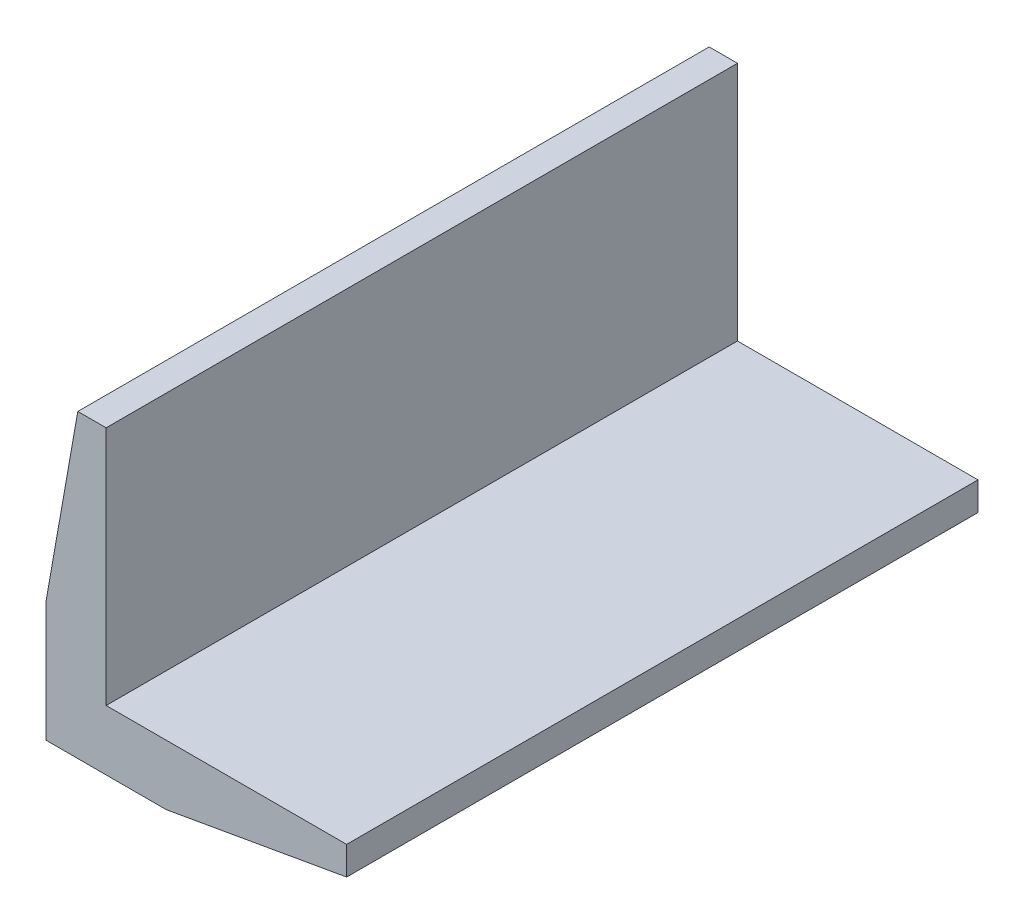
ISO-10303-21;
HEADER;
FILE_DESCRIPTION(('STEP AP214'),'2;1');
FILE_NAME('part.step','',(''),(''),'','','');
FILE_SCHEMA(('AUTOMOTIVE_DESIGN { 1 0 10303 214 1 1 1 1 }'));
ENDSEC;
DATA;
#1=APPLICATION_CONTEXT('core data for automotive mechanical design processes');
#2=APPLICATION_PROTOCOL_DEFINITION('international standard','automotive_design',2000,#1);
#3=PRODUCT_CONTEXT('',#1,'mechanical');
#4=PRODUCT('Part','Part','',(#3));
#5=PRODUCT_RELATED_PRODUCT_CATEGORY('part','',(#4));
#6=PRODUCT_DEFINITION_FORMATION('','',#4);
#7=PRODUCT_DEFINITION_CONTEXT('part definition',#1,'design');
#8=PRODUCT_DEFINITION('design','',#6,#7);
#9=PRODUCT_DEFINITION_SHAPE('','',#8);
#10=(LENGTH_UNIT() NAMED_UNIT(*) SI_UNIT(.MILLI.,.METRE.));
#11=(NAMED_UNIT(*) PLANE_ANGLE_UNIT() SI_UNIT($,.RADIAN.));
#12=(NAMED_UNIT(*) SI_UNIT($,.STERADIAN.) SOLID_ANGLE_UNIT());
#13=UNCERTAINTY_MEASURE_WITH_UNIT(LENGTH_MEASURE(1.E-05),#10,'distance_accuracy_value','');
#14=(GEOMETRIC_REPRESENTATION_CONTEXT(3) GLOBAL_UNCERTAINTY_ASSIGNED_CONTEXT((#13)) GLOBAL_UNIT_ASSIGNED_CONTEXT((#10,
#11,#12)) REPRESENTATION_CONTEXT('',''));
#15=CARTESIAN_POINT('',(0.,0.,0.));
#16=DIRECTION('',(0.,0.,1.));
#17=DIRECTION('',(1.,0.,0.));
#18=AXIS2_PLACEMENT_3D('',#15,#16,#17);
#19=CARTESIAN_POINT('',(20.,0.,42.));
#20=DIRECTION('',(0.,1.,0.));
#21=DIRECTION('',(-1.,0.,0.));
#22=AXIS2_PLACEMENT_3D('',#19,#20,#21);
#23=PLANE('',#22);
#24=CARTESIAN_POINT('',(4.,0.,40.));
#25=DIRECTION('',(0.,1.,0.));
#26=DIRECTION('',(1.,0.,0.));
#27=AXIS2_PLACEMENT_3D('',#24,#25,#26);
#28=ELLIPSE('',#27,1.59099025766973,1.125);
#29=CARTESIAN_POINT('',(5.59099025766973,0.,40.));
#30=VERTEX_POINT('',#29);
#31=EDGE_CURVE('E137',#30,#30,#28,.T.);
#32=ORIENTED_EDGE('',*,*,#31,.T.);
#33=EDGE_LOOP('',(#32));
#34=FACE_BOUND('',#33,.T.);
#35=CARTESIAN_POINT('',(4.,0.,37.2857142857143));
#36=DIRECTION('',(0.,1.,0.));
#37=DIRECTION('',(1.,0.,0.));
#38=AXIS2_PLACEMENT_3D('',#35,#36,#37);
#39=ELLIPSE('',#38,1.59099025766973,1.125);
#40=CARTESIAN_POINT('',(5.59099025766973,0.,37.2857142857143));
#41=VERTEX_POINT('',#40);
#42=EDGE_CURVE('E208',#41,#41,#39,.T.);
#43=ORIENTED_EDGE('',*,*,#42,.T.);
#44=EDGE_LOOP('',(#43));
#45=FACE_BOUND('',#44,.T.);
#46=CARTESIAN_POINT('',(4.,0.,34.5714285714286));
#47=DIRECTION('',(0.,1.,0.));
#48=DIRECTION('',(1.,0.,0.));
#49=AXIS2_PLACEMENT_3D('',#46,#47,#48);
#50=ELLIPSE('',#49,1.59099025766973,1.125);
#51=CARTESIAN_POINT('',(5.59099025766973,0.,34.5714285714286));
#52=VERTEX_POINT('',#51);
#53=EDGE_CURVE('E204',#52,#52,#50,.T.);
#54=ORIENTED_EDGE('',*,*,#53,.T.);
#55=EDGE_LOOP('',(#54));
#56=FACE_BOUND('',#55,.T.);
#57=CARTESIAN_POINT('',(4.,0.,31.8571428571429));
#58=DIRECTION('',(0.,1.,0.));
#59=DIRECTION('',(1.,0.,0.));
#60=AXIS2_PLACEMENT_3D('',#57,#58,#59);
#61=ELLIPSE('',#60,1.59099025766973,1.125);
#62=CARTESIAN_POINT('',(5.59099025766973,0.,31.8571428571429));
#63=VERTEX_POINT('',#62);
#64=EDGE_CURVE('E200',#63,#63,#61,.T.);
#65=ORIENTED_EDGE('',*,*,#64,.T.);
#66=EDGE_LOOP('',(#65));
#67=FACE_BOUND('',#66,.T.);
#68=CARTESIAN_POINT('',(4.,0.,29.1428571428571));
#69=DIRECTION('',(0.,1.,0.));
#70=DIRECTION('',(1.,0.,0.));
#71=AXIS2_PLACEMENT_3D('',#68,#69,#70);
#72=ELLIPSE('',#71,1.59099025766973,1.125);
#73=CARTESIAN_POINT('',(5.59099025766974,0.,29.1428571428571));
#74=VERTEX_POINT('',#73);
#75=EDGE_CURVE('E196',#74,#74,#72,.T.);
#76=ORIENTED_EDGE('',*,*,#75,.T.);
#77=EDGE_LOOP('',(#76));
#78=FACE_BOUND('',#77,.T.);
#79=CARTESIAN_POINT('',(4.,0.,26.4285714285714));
#80=DIRECTION('',(0.,1.,0.));
#81=DIRECTION('',(1.,0.,0.));
#82=AXIS2_PLACEMENT_3D('',#79,#80,#81);
#83=ELLIPSE('',#82,1.59099025766973,1.125);
#84=CARTESIAN_POINT('',(5.59099025766974,0.,26.4285714285714));
#85=VERTEX_POINT('',#84);
#86=EDGE_CURVE('E192',#85,#85,#83,.T.);
#87=ORIENTED_EDGE('',*,*,#86,.T.);
#88=EDGE_LOOP('',(#87));
#89=FACE_BOUND('',#88,.T.);
#90=CARTESIAN_POINT('',(4.,0.,23.7142857142857));
#91=DIRECTION('',(0.,1.,0.));
#92=DIRECTION('',(1.,0.,0.));
#93=AXIS2_PLACEMENT_3D('',#90,#91,#92);
#94=ELLIPSE('',#93,1.59099025766973,1.125);
#95=CARTESIAN_POINT('',(5.59099025766974,0.,23.7142857142857));
#96=VERTEX_POINT('',#95);
#97=EDGE_CURVE('E188',#96,#96,#94,.T.);
#98=ORIENTED_EDGE('',*,*,#97,.T.);
#99=EDGE_LOOP('',(#98));
#100=FACE_BOUND('',#99,.T.);
#101=CARTESIAN_POINT('',(4.,0.,21.));
#102=DIRECTION('',(0.,1.,0.));
#103=DIRECTION('',(1.,0.,0.));
#104=AXIS2_PLACEMENT_3D('',#101,#102,#103);
#105=ELLIPSE('',#104,1.59099025766973,1.125);
#106=CARTESIAN_POINT('',(5.59099025766974,0.,21.));
#107=VERTEX_POINT('',#106);
#108=EDGE_CURVE('E184',#107,#107,#105,.T.);
#109=ORIENTED_EDGE('',*,*,#108,.T.);
#110=EDGE_LOOP('',(#109));
#111=FACE_BOUND('',#110,.T.);
#112=CARTESIAN_POINT('',(4.,0.,18.2857142857143));
#113=DIRECTION('',(0.,1.,0.));
#114=DIRECTION('',(1.,0.,0.));
#115=AXIS2_PLACEMENT_3D('',#112,#113,#114);
#116=ELLIPSE('',#115,1.59099025766973,1.125);
#117=CARTESIAN_POINT('',(5.59099025766974,0.,18.2857142857143));
#118=VERTEX_POINT('',#117);
#119=EDGE_CURVE('E180',#118,#118,#116,.T.);
#120=ORIENTED_EDGE('',*,*,#119,.T.);
#121=EDGE_LOOP('',(#120));
#122=FACE_BOUND('',#121,.T.);
#123=CARTESIAN_POINT('',(4.,0.,15.5714285714286));
#124=DIRECTION('',(0.,1.,0.));
#125=DIRECTION('',(1.,0.,0.));
#126=AXIS2_PLACEMENT_3D('',#123,#124,#125);
#127=ELLIPSE('',#126,1.59099025766973,1.125);
#128=CARTESIAN_POINT('',(5.59099025766974,0.,15.5714285714286));
#129=VERTEX_POINT('',#128);
#130=EDGE_CURVE('E176',#129,#129,#127,.T.);
#131=ORIENTED_EDGE('',*,*,#130,.T.);
#132=EDGE_LOOP('',(#131));
#133=FACE_BOUND('',#132,.T.);
#134=CARTESIAN_POINT('',(4.,0.,12.8571428571429));
#135=DIRECTION('',(0.,1.,0.));
#136=DIRECTION('',(1.,0.,0.));
#137=AXIS2_PLACEMENT_3D('',#134,#135,#136);
#138=ELLIPSE('',#137,1.59099025766973,1.125);
#139=CARTESIAN_POINT('',(5.59099025766974,0.,12.8571428571429));
#140=VERTEX_POINT('',#139);
#141=EDGE_CURVE('E172',#140,#140,#138,.T.);
#142=ORIENTED_EDGE('',*,*,#141,.T.);
#143=EDGE_LOOP('',(#142));
#144=FACE_BOUND('',#143,.T.);
#145=CARTESIAN_POINT('',(4.,0.,10.1428571428571));
#146=DIRECTION('',(0.,1.,0.));
#147=DIRECTION('',(1.,0.,0.));
#148=AXIS2_PLACEMENT_3D('',#145,#146,#147);
#149=ELLIPSE('',#148,1.59099025766973,1.125);
#150=CARTESIAN_POINT('',(5.59099025766974,0.,10.1428571428571));
#151=VERTEX_POINT('',#150);
#152=EDGE_CURVE('E168',#151,#151,#149,.T.);
#153=ORIENTED_EDGE('',*,*,#152,.T.);
#154=EDGE_LOOP('',(#153));
#155=FACE_BOUND('',#154,.T.);
#156=CARTESIAN_POINT('',(4.,0.,7.42857142857143));
#157=DIRECTION('',(0.,1.,0.));
#158=DIRECTION('',(1.,0.,0.));
#159=AXIS2_PLACEMENT_3D('',#156,#157,#158);
#160=ELLIPSE('',#159,1.59099025766973,1.125);
#161=CARTESIAN_POINT('',(5.59099025766973,0.,7.42857142857143));
#162=VERTEX_POINT('',#161);
#163=EDGE_CURVE('E164',#162,#162,#160,.T.);
#164=ORIENTED_EDGE('',*,*,#163,.T.);
#165=EDGE_LOOP('',(#164));
#166=FACE_BOUND('',#165,.T.);
#167=CARTESIAN_POINT('',(4.,0.,4.71428571428572));
#168=DIRECTION('',(0.,1.,0.));
#169=DIRECTION('',(1.,0.,0.));
#170=AXIS2_PLACEMENT_3D('',#167,#168,#169);
#171=ELLIPSE('',#170,1.59099025766973,1.125);
#172=CARTESIAN_POINT('',(5.59099025766973,0.,4.71428571428572));
#173=VERTEX_POINT('',#172);
#174=EDGE_CURVE('E160',#173,#173,#171,.T.);
#175=ORIENTED_EDGE('',*,*,#174,.T.);
#176=EDGE_LOOP('',(#175));
#177=FACE_BOUND('',#176,.T.);
#178=CARTESIAN_POINT('',(4.,0.,2.));
#179=DIRECTION('',(0.,1.,0.));
#180=DIRECTION('',(1.,0.,0.));
#181=AXIS2_PLACEMENT_3D('',#178,#179,#180);
#182=ELLIPSE('',#181,1.59099025766973,1.125);
#183=CARTESIAN_POINT('',(5.59099025766973,0.,2.));
#184=VERTEX_POINT('',#183);
#185=EDGE_CURVE('E156',#184,#184,#182,.T.);
#186=ORIENTED_EDGE('',*,*,#185,.T.);
#187=EDGE_LOOP('',(#186));
#188=FACE_BOUND('',#187,.T.);
#189=DIRECTION('',(1.,0.,0.));
#190=VECTOR('',#189,1.);
#191=CARTESIAN_POINT('',(20.,0.,0.));
#192=LINE('',#191,#190);
#193=CARTESIAN_POINT('',(0.,0.,0.));
#194=VERTEX_POINT('',#193);
#195=CARTESIAN_POINT('',(7.99999999999977,0.,0.));
#196=VERTEX_POINT('',#195);
#197=EDGE_CURVE('E134',#194,#196,#192,.T.);
#198=ORIENTED_EDGE('',*,*,#197,.T.);
#199=DIRECTION('',(0.,0.,1.));
#200=VECTOR('',#199,1.);
#201=CARTESIAN_POINT('',(7.99999999999977,0.,42.));
#202=LINE('',#201,#200);
#203=CARTESIAN_POINT('',(7.99999999999977,0.,42.));
#204=VERTEX_POINT('',#203);
#205=EDGE_CURVE('E215',#196,#204,#202,.T.);
#206=ORIENTED_EDGE('',*,*,#205,.T.);
#207=DIRECTION('',(1.,0.,0.));
#208=VECTOR('',#207,1.);
#209=CARTESIAN_POINT('',(20.,0.,42.));
#210=LINE('',#209,#208);
#211=CARTESIAN_POINT('',(0.,0.,42.));
#212=VERTEX_POINT('',#211);
#213=EDGE_CURVE('E109',#212,#204,#210,.T.);
#214=ORIENTED_EDGE('',*,*,#213,.F.);
#215=DIRECTION('',(0.,0.,-1.));
#216=VECTOR('',#215,1.);
#217=CARTESIAN_POINT('',(0.,0.,42.));
#218=LINE('',#217,#216);
#219=EDGE_CURVE('E133',#212,#194,#218,.T.);
#220=ORIENTED_EDGE('',*,*,#219,.T.);
#221=EDGE_LOOP('',(#198,#206,#214,#220));
#222=FACE_BOUND('',#221,.T.);
#223=ADVANCED_FACE('F33',(#34,#45,#56,#67,#78,#89,#100,#111,#122,#133,#144,#155,#166,#177,#188,
#222),#23,.F.);
#224=CARTESIAN_POINT('',(20.,4.,42.));
#225=DIRECTION('',(-1.,0.,0.));
#226=DIRECTION('',(0.,0.,1.));
#227=AXIS2_PLACEMENT_3D('',#224,#225,#226);
#228=PLANE('',#227);
#229=DIRECTION('',(0.,1.,0.));
#230=VECTOR('',#229,1.);
#231=CARTESIAN_POINT('',(20.,4.,42.));
#232=LINE('',#231,#230);
#233=CARTESIAN_POINT('',(20.,2.11592376850158,42.));
#234=VERTEX_POINT('',#233);
#235=CARTESIAN_POINT('',(20.,4.,42.));
#236=VERTEX_POINT('',#235);
#237=EDGE_CURVE('E97',#234,#236,#232,.T.);
#238=ORIENTED_EDGE('',*,*,#237,.F.);
#239=DIRECTION('',(0.,0.,-1.));
#240=VECTOR('',#239,1.);
#241=CARTESIAN_POINT('',(20.,2.11592376850158,42.));
#242=LINE('',#241,#240);
#243=CARTESIAN_POINT('',(20.,2.11592376850158,0.));
#244=VERTEX_POINT('',#243);
#245=EDGE_CURVE('E118',#234,#244,#242,.T.);
#246=ORIENTED_EDGE('',*,*,#245,.T.);
#247=DIRECTION('',(0.,1.,0.));
#248=VECTOR('',#247,1.);
#249=CARTESIAN_POINT('',(20.,4.,0.));
#250=LINE('',#249,#248);
#251=CARTESIAN_POINT('',(20.,4.,0.));
#252=VERTEX_POINT('',#251);
#253=EDGE_CURVE('E115',#244,#252,#250,.T.);
#254=ORIENTED_EDGE('',*,*,#253,.T.);
#255=DIRECTION('',(0.,0.,-1.));
#256=VECTOR('',#255,1.);
#257=CARTESIAN_POINT('',(20.,4.,42.));
#258=LINE('',#257,#256);
#259=EDGE_CURVE('E112',#236,#252,#258,.T.);
#260=ORIENTED_EDGE('',*,*,#259,.F.);
#261=EDGE_LOOP('',(#238,#246,#254,#260));
#262=FACE_BOUND('',#261,.T.);
#263=ADVANCED_FACE('F113',(#262),#228,.F.);
#264=CARTESIAN_POINT('',(4.,4.,42.));
#265=DIRECTION('',(0.,-1.,0.));
#266=DIRECTION('',(0.,0.,-1.));
#267=AXIS2_PLACEMENT_3D('',#264,#265,#266);
#268=PLANE('',#267);
#269=DIRECTION('',(-1.,0.,0.));
#270=VECTOR('',#269,1.);
#271=CARTESIAN_POINT('',(4.,4.,0.));
#272=LINE('',#271,#270);
#273=CARTESIAN_POINT('',(4.,4.,0.));
#274=VERTEX_POINT('',#273);
#275=EDGE_CURVE('E139',#252,#274,#272,.T.);
#276=ORIENTED_EDGE('',*,*,#275,.T.);
#277=DIRECTION('',(0.,0.,-1.));
#278=VECTOR('',#277,1.);
#279=CARTESIAN_POINT('',(4.,4.,42.));
#280=LINE('',#279,#278);
#281=CARTESIAN_POINT('',(4.,4.,42.));
#282=VERTEX_POINT('',#281);
#283=EDGE_CURVE('E119',#282,#274,#280,.T.);
#284=ORIENTED_EDGE('',*,*,#283,.F.);
#285=DIRECTION('',(-1.,0.,0.));
#286=VECTOR('',#285,1.);
#287=CARTESIAN_POINT('',(4.,4.,42.));
#288=LINE('',#287,#286);
#289=EDGE_CURVE('E101',#236,#282,#288,.T.);
#290=ORIENTED_EDGE('',*,*,#289,.F.);
#291=ORIENTED_EDGE('',*,*,#259,.T.);
#292=EDGE_LOOP('',(#276,#284,#290,#291));
#293=FACE_BOUND('',#292,.T.);
#294=ADVANCED_FACE('F121',(#293),#268,.F.);
#295=CARTESIAN_POINT('',(4.,20.,42.));
#296=DIRECTION('',(-1.,0.,0.));
#297=DIRECTION('',(0.,-1.,0.));
#298=AXIS2_PLACEMENT_3D('',#295,#296,#297);
#299=PLANE('',#298);
#300=DIRECTION('',(0.,1.,0.));
#301=VECTOR('',#300,1.);
#302=CARTESIAN_POINT('',(4.,20.,0.));
#303=LINE('',#302,#301);
#304=CARTESIAN_POINT('',(4.,20.,0.));
#305=VERTEX_POINT('',#304);
#306=EDGE_CURVE('E141',#274,#305,#303,.T.);
#307=ORIENTED_EDGE('',*,*,#306,.T.);
#308=DIRECTION('',(0.,0.,-1.));
#309=VECTOR('',#308,1.);
#310=CARTESIAN_POINT('',(4.,20.,42.));
#311=LINE('',#310,#309);
#312=CARTESIAN_POINT('',(4.,20.,42.));
#313=VERTEX_POINT('',#312);
#314=EDGE_CURVE('E149',#313,#305,#311,.T.);
#315=ORIENTED_EDGE('',*,*,#314,.F.);
#316=DIRECTION('',(0.,1.,0.));
#317=VECTOR('',#316,1.);
#318=CARTESIAN_POINT('',(4.,20.,42.));
#319=LINE('',#318,#317);
#320=EDGE_CURVE('E124',#282,#313,#319,.T.);
#321=ORIENTED_EDGE('',*,*,#320,.F.);
#322=ORIENTED_EDGE('',*,*,#283,.T.);
#323=EDGE_LOOP('',(#307,#315,#321,#322));
#324=FACE_BOUND('',#323,.T.);
#325=ADVANCED_FACE('F237',(#324),#299,.F.);
#326=CARTESIAN_POINT('',(0.,20.,42.));
#327=DIRECTION('',(0.,-1.,0.));
#328=DIRECTION('',(0.,0.,-1.));
#329=AXIS2_PLACEMENT_3D('',#326,#327,#328);
#330=PLANE('',#329);
#331=DIRECTION('',(-1.,0.,0.));
#332=VECTOR('',#331,1.);
#333=CARTESIAN_POINT('',(0.,20.,0.));
#334=LINE('',#333,#332);
#335=CARTESIAN_POINT('',(2.11592376850158,20.,0.));
#336=VERTEX_POINT('',#335);
#337=EDGE_CURVE('E143',#305,#336,#334,.T.);
#338=ORIENTED_EDGE('',*,*,#337,.T.);
#339=DIRECTION('',(0.,0.,1.));
#340=VECTOR('',#339,1.);
#341=CARTESIAN_POINT('',(2.11592376850158,20.,42.));
#342=LINE('',#341,#340);
#343=CARTESIAN_POINT('',(2.11592376850158,20.,42.));
#344=VERTEX_POINT('',#343);
#345=EDGE_CURVE('E41',#336,#344,#342,.T.);
#346=ORIENTED_EDGE('',*,*,#345,.T.);
#347=DIRECTION('',(-1.,0.,0.));
#348=VECTOR('',#347,1.);
#349=CARTESIAN_POINT('',(0.,20.,42.));
#350=LINE('',#349,#348);
#351=EDGE_CURVE('E126',#313,#344,#350,.T.);
#352=ORIENTED_EDGE('',*,*,#351,.F.);
#353=ORIENTED_EDGE('',*,*,#314,.T.);
#354=EDGE_LOOP('',(#338,#346,#352,#353));
#355=FACE_BOUND('',#354,.T.);
#356=ADVANCED_FACE('F258',(#355),#330,.F.);
#357=CARTESIAN_POINT('',(0.,0.,42.));
#358=DIRECTION('',(1.,0.,0.));
#359=DIRECTION('',(0.,1.,0.));
#360=AXIS2_PLACEMENT_3D('',#357,#358,#359);
#361=PLANE('',#360);
#362=CARTESIAN_POINT('',(0.,4.00000000000001,40.));
#363=DIRECTION('',(1.,0.,0.));
#364=DIRECTION('',(0.,-1.,0.));
#365=AXIS2_PLACEMENT_3D('',#362,#363,#364);
#366=ELLIPSE('',#365,1.59099025766973,1.125);
#367=CARTESIAN_POINT('',(0.,2.40900974233028,40.));
#368=VERTEX_POINT('',#367);
#369=EDGE_CURVE('E209',#368,#368,#366,.T.);
#370=ORIENTED_EDGE('',*,*,#369,.T.);
#371=EDGE_LOOP('',(#370));
#372=FACE_BOUND('',#371,.T.);
#373=CARTESIAN_POINT('',(0.,4.00000000000001,37.2857142857143));
#374=DIRECTION('',(1.,0.,0.));
#375=DIRECTION('',(0.,-1.,0.));
#376=AXIS2_PLACEMENT_3D('',#373,#374,#375);
#377=ELLIPSE('',#376,1.59099025766973,1.125);
#378=CARTESIAN_POINT('',(0.,2.40900974233028,37.2857142857143));
#379=VERTEX_POINT('',#378);
#380=EDGE_CURVE('E205',#379,#379,#377,.T.);
#381=ORIENTED_EDGE('',*,*,#380,.T.);
#382=EDGE_LOOP('',(#381));
#383=FACE_BOUND('',#382,.T.);
#384=CARTESIAN_POINT('',(0.,4.00000000000001,34.5714285714286));
#385=DIRECTION('',(1.,0.,0.));
#386=DIRECTION('',(0.,-1.,0.));
#387=AXIS2_PLACEMENT_3D('',#384,#385,#386);
#388=ELLIPSE('',#387,1.59099025766973,1.125);
#389=CARTESIAN_POINT('',(0.,2.40900974233028,34.5714285714286));
#390=VERTEX_POINT('',#389);
#391=EDGE_CURVE('E201',#390,#390,#388,.T.);
#392=ORIENTED_EDGE('',*,*,#391,.T.);
#393=EDGE_LOOP('',(#392));
#394=FACE_BOUND('',#393,.T.);
#395=CARTESIAN_POINT('',(0.,4.00000000000001,31.8571428571429));
#396=DIRECTION('',(1.,0.,0.));
#397=DIRECTION('',(0.,-1.,0.));
#398=AXIS2_PLACEMENT_3D('',#395,#396,#397);
#399=ELLIPSE('',#398,1.59099025766973,1.125);
#400=CARTESIAN_POINT('',(0.,2.40900974233028,31.8571428571429));
#401=VERTEX_POINT('',#400);
#402=EDGE_CURVE('E197',#401,#401,#399,.T.);
#403=ORIENTED_EDGE('',*,*,#402,.T.);
#404=EDGE_LOOP('',(#403));
#405=FACE_BOUND('',#404,.T.);
#406=CARTESIAN_POINT('',(0.,4.00000000000001,29.1428571428571));
#407=DIRECTION('',(1.,0.,0.));
#408=DIRECTION('',(0.,-1.,0.));
#409=AXIS2_PLACEMENT_3D('',#406,#407,#408);
#410=ELLIPSE('',#409,1.59099025766973,1.125);
#411=CARTESIAN_POINT('',(0.,2.40900974233027,29.1428571428571));
#412=VERTEX_POINT('',#411);
#413=EDGE_CURVE('E193',#412,#412,#410,.T.);
#414=ORIENTED_EDGE('',*,*,#413,.T.);
#415=EDGE_LOOP('',(#414));
#416=FACE_BOUND('',#415,.T.);
#417=CARTESIAN_POINT('',(0.,4.00000000000001,26.4285714285714));
#418=DIRECTION('',(1.,0.,0.));
#419=DIRECTION('',(0.,-1.,0.));
#420=AXIS2_PLACEMENT_3D('',#417,#418,#419);
#421=ELLIPSE('',#420,1.59099025766973,1.125);
#422=CARTESIAN_POINT('',(0.,2.40900974233027,26.4285714285714));
#423=VERTEX_POINT('',#422);
#424=EDGE_CURVE('E189',#423,#423,#421,.T.);
#425=ORIENTED_EDGE('',*,*,#424,.T.);
#426=EDGE_LOOP('',(#425));
#427=FACE_BOUND('',#426,.T.);
#428=CARTESIAN_POINT('',(0.,4.00000000000001,23.7142857142857));
#429=DIRECTION('',(1.,0.,0.));
#430=DIRECTION('',(0.,-1.,0.));
#431=AXIS2_PLACEMENT_3D('',#428,#429,#430);
#432=ELLIPSE('',#431,1.59099025766973,1.125);
#433=CARTESIAN_POINT('',(0.,2.40900974233027,23.7142857142857));
#434=VERTEX_POINT('',#433);
#435=EDGE_CURVE('E185',#434,#434,#432,.T.);
#436=ORIENTED_EDGE('',*,*,#435,.T.);
#437=EDGE_LOOP('',(#436));
#438=FACE_BOUND('',#437,.T.);
#439=CARTESIAN_POINT('',(0.,4.00000000000001,21.));
#440=DIRECTION('',(1.,0.,0.));
#441=DIRECTION('',(0.,-1.,0.));
#442=AXIS2_PLACEMENT_3D('',#439,#440,#441);
#443=ELLIPSE('',#442,1.59099025766973,1.125);
#444=CARTESIAN_POINT('',(0.,2.40900974233027,21.));
#445=VERTEX_POINT('',#444);
#446=EDGE_CURVE('E181',#445,#445,#443,.T.);
#447=ORIENTED_EDGE('',*,*,#446,.T.);
#448=EDGE_LOOP('',(#447));
#449=FACE_BOUND('',#448,.T.);
#450=CARTESIAN_POINT('',(0.,4.00000000000001,18.2857142857143));
#451=DIRECTION('',(1.,0.,0.));
#452=DIRECTION('',(0.,-1.,0.));
#453=AXIS2_PLACEMENT_3D('',#450,#451,#452);
#454=ELLIPSE('',#453,1.59099025766973,1.125);
#455=CARTESIAN_POINT('',(0.,2.40900974233027,18.2857142857143));
#456=VERTEX_POINT('',#455);
#457=EDGE_CURVE('E177',#456,#456,#454,.T.);
#458=ORIENTED_EDGE('',*,*,#457,.T.);
#459=EDGE_LOOP('',(#458));
#460=FACE_BOUND('',#459,.T.);
#461=CARTESIAN_POINT('',(0.,4.00000000000001,15.5714285714286));
#462=DIRECTION('',(1.,0.,0.));
#463=DIRECTION('',(0.,-1.,0.));
#464=AXIS2_PLACEMENT_3D('',#461,#462,#463);
#465=ELLIPSE('',#464,1.59099025766973,1.125);
#466=CARTESIAN_POINT('',(0.,2.40900974233027,15.5714285714286));
#467=VERTEX_POINT('',#466);
#468=EDGE_CURVE('E173',#467,#467,#465,.T.);
#469=ORIENTED_EDGE('',*,*,#468,.T.);
#470=EDGE_LOOP('',(#469));
#471=FACE_BOUND('',#470,.T.);
#472=CARTESIAN_POINT('',(0.,4.00000000000001,12.8571428571429));
#473=DIRECTION('',(1.,0.,0.));
#474=DIRECTION('',(0.,-1.,0.));
#475=AXIS2_PLACEMENT_3D('',#472,#473,#474);
#476=ELLIPSE('',#475,1.59099025766973,1.125);
#477=CARTESIAN_POINT('',(0.,2.40900974233027,12.8571428571429));
#478=VERTEX_POINT('',#477);
#479=EDGE_CURVE('E169',#478,#478,#476,.T.);
#480=ORIENTED_EDGE('',*,*,#479,.T.);
#481=EDGE_LOOP('',(#480));
#482=FACE_BOUND('',#481,.T.);
#483=CARTESIAN_POINT('',(0.,4.00000000000001,10.1428571428571));
#484=DIRECTION('',(1.,0.,0.));
#485=DIRECTION('',(0.,-1.,0.));
#486=AXIS2_PLACEMENT_3D('',#483,#484,#485);
#487=ELLIPSE('',#486,1.59099025766973,1.125);
#488=CARTESIAN_POINT('',(0.,2.40900974233027,10.1428571428571));
#489=VERTEX_POINT('',#488);
#490=EDGE_CURVE('E165',#489,#489,#487,.T.);
#491=ORIENTED_EDGE('',*,*,#490,.T.);
#492=EDGE_LOOP('',(#491));
#493=FACE_BOUND('',#492,.T.);
#494=CARTESIAN_POINT('',(0.,4.00000000000001,7.42857142857143));
#495=DIRECTION('',(1.,0.,0.));
#496=DIRECTION('',(0.,-1.,0.));
#497=AXIS2_PLACEMENT_3D('',#494,#495,#496);
#498=ELLIPSE('',#497,1.59099025766973,1.125);
#499=CARTESIAN_POINT('',(0.,2.40900974233027,7.42857142857143));
#500=VERTEX_POINT('',#499);
#501=EDGE_CURVE('E161',#500,#500,#498,.T.);
#502=ORIENTED_EDGE('',*,*,#501,.T.);
#503=EDGE_LOOP('',(#502));
#504=FACE_BOUND('',#503,.T.);
#505=CARTESIAN_POINT('',(0.,4.00000000000001,4.71428571428572));
#506=DIRECTION('',(1.,0.,0.));
#507=DIRECTION('',(0.,-1.,0.));
#508=AXIS2_PLACEMENT_3D('',#505,#506,#507);
#509=ELLIPSE('',#508,1.59099025766973,1.125);
#510=CARTESIAN_POINT('',(0.,2.40900974233027,4.71428571428572));
#511=VERTEX_POINT('',#510);
#512=EDGE_CURVE('E157',#511,#511,#509,.T.);
#513=ORIENTED_EDGE('',*,*,#512,.T.);
#514=EDGE_LOOP('',(#513));
#515=FACE_BOUND('',#514,.T.);
#516=CARTESIAN_POINT('',(0.,4.00000000000001,2.));
#517=DIRECTION('',(1.,0.,0.));
#518=DIRECTION('',(0.,-1.,0.));
#519=AXIS2_PLACEMENT_3D('',#516,#517,#518);
#520=ELLIPSE('',#519,1.59099025766973,1.125);
#521=CARTESIAN_POINT('',(0.,2.40900974233027,2.));
#522=VERTEX_POINT('',#521);
#523=EDGE_CURVE('E153',#522,#522,#520,.T.);
#524=ORIENTED_EDGE('',*,*,#523,.T.);
#525=EDGE_LOOP('',(#524));
#526=FACE_BOUND('',#525,.T.);
#527=DIRECTION('',(0.,-1.,0.));
#528=VECTOR('',#527,1.);
#529=CARTESIAN_POINT('',(0.,0.,42.));
#530=LINE('',#529,#528);
#531=CARTESIAN_POINT('',(0.,7.99999999999977,42.));
#532=VERTEX_POINT('',#531);
#533=EDGE_CURVE('E131',#532,#212,#530,.T.);
#534=ORIENTED_EDGE('',*,*,#533,.F.);
#535=DIRECTION('',(0.,0.,-1.));
#536=VECTOR('',#535,1.);
#537=CARTESIAN_POINT('',(0.,7.99999999999977,42.));
#538=LINE('',#537,#536);
#539=CARTESIAN_POINT('',(0.,7.99999999999977,0.));
#540=VERTEX_POINT('',#539);
#541=EDGE_CURVE('E218',#532,#540,#538,.T.);
#542=ORIENTED_EDGE('',*,*,#541,.T.);
#543=DIRECTION('',(0.,-1.,0.));
#544=VECTOR('',#543,1.);
#545=CARTESIAN_POINT('',(0.,0.,0.));
#546=LINE('',#545,#544);
#547=EDGE_CURVE('E145',#540,#194,#546,.T.);
#548=ORIENTED_EDGE('',*,*,#547,.T.);
#549=ORIENTED_EDGE('',*,*,#219,.F.);
#550=EDGE_LOOP('',(#534,#542,#548,#549));
#551=FACE_BOUND('',#550,.T.);
#552=ADVANCED_FACE('F224',(#372,#383,#394,#405,#416,#427,#438,#449,#460,#471,#482,#493,#504,
#515,#526,#551),#361,.F.);
#553=CARTESIAN_POINT('',(0.,0.,42.));
#554=DIRECTION('',(0.,0.,-1.));
#555=DIRECTION('',(-1.,0.,0.));
#556=AXIS2_PLACEMENT_3D('',#553,#554,#555);
#557=PLANE('',#556);
#558=ORIENTED_EDGE('',*,*,#351,.T.);
#559=DIRECTION('',(0.173648177666927,0.984807753012209,0.));
#560=VECTOR('',#559,1.);
#561=CARTESIAN_POINT('',(0.,7.99999999999977,42.));
#562=LINE('',#561,#560);
#563=EDGE_CURVE('E11',#344,#532,#562,.F.);
#564=ORIENTED_EDGE('',*,*,#563,.T.);
#565=ORIENTED_EDGE('',*,*,#533,.T.);
#566=ORIENTED_EDGE('',*,*,#213,.T.);
#567=DIRECTION('',(-0.984807753012209,-0.173648177666927,0.));
#568=VECTOR('',#567,1.);
#569=CARTESIAN_POINT('',(20.,2.11592376850158,42.));
#570=LINE('',#569,#568);
#571=EDGE_CURVE('E105',#204,#234,#570,.F.);
#572=ORIENTED_EDGE('',*,*,#571,.T.);
#573=ORIENTED_EDGE('',*,*,#237,.T.);
#574=ORIENTED_EDGE('',*,*,#289,.T.);
#575=ORIENTED_EDGE('',*,*,#320,.T.);
#576=EDGE_LOOP('',(#558,#564,#565,#566,#572,#573,#574,#575));
#577=FACE_BOUND('',#576,.T.);
#578=ADVANCED_FACE('F99',(#577),#557,.F.);
#579=CARTESIAN_POINT('',(0.,0.,0.));
#580=DIRECTION('',(0.,0.,-1.));
#581=DIRECTION('',(-1.,0.,0.));
#582=AXIS2_PLACEMENT_3D('',#579,#580,#581);
#583=PLANE('',#582);
#584=ORIENTED_EDGE('',*,*,#547,.F.);
#585=DIRECTION('',(-0.173648177666927,-0.984807753012209,0.));
#586=VECTOR('',#585,1.);
#587=CARTESIAN_POINT('',(-1.36808057330261,0.241229516856351,0.));
#588=LINE('',#587,#586);
#589=EDGE_CURVE('E55',#540,#336,#588,.F.);
#590=ORIENTED_EDGE('',*,*,#589,.T.);
#591=ORIENTED_EDGE('',*,*,#337,.F.);
#592=ORIENTED_EDGE('',*,*,#306,.F.);
#593=ORIENTED_EDGE('',*,*,#275,.F.);
#594=ORIENTED_EDGE('',*,*,#253,.F.);
#595=DIRECTION('',(0.984807753012209,0.173648177666927,0.));
#596=VECTOR('',#595,1.);
#597=CARTESIAN_POINT('',(0.241229516856351,-1.36808057330261,0.));
#598=LINE('',#597,#596);
#599=EDGE_CURVE('E213',#244,#196,#598,.F.);
#600=ORIENTED_EDGE('',*,*,#599,.T.);
#601=ORIENTED_EDGE('',*,*,#197,.F.);
#602=EDGE_LOOP('',(#584,#590,#591,#592,#593,#594,#600,#601));
#603=FACE_BOUND('',#602,.T.);
#604=ADVANCED_FACE('F229',(#603),#583,.T.);
#605=CARTESIAN_POINT('',(-8.,12.,2.));
#606=DIRECTION('',(0.707106781186547,-0.707106781186547,0.));
#607=DIRECTION('',(0.707106781186548,0.707106781186547,0.));
#608=AXIS2_PLACEMENT_3D('',#605,#606,#607);
#609=CYLINDRICAL_SURFACE('',#608,1.125);
#610=ORIENTED_EDGE('',*,*,#523,.F.);
#611=EDGE_LOOP('',(#610));
#612=FACE_BOUND('',#611,.T.);
#613=ORIENTED_EDGE('',*,*,#185,.F.);
#614=EDGE_LOOP('',(#613));
#615=FACE_BOUND('',#614,.T.);
#616=ADVANCED_FACE('F266',(#612,#615),#609,.F.);
#617=CARTESIAN_POINT('',(-8.,12.,4.71428571428572));
#618=DIRECTION('',(0.707106781186547,-0.707106781186547,0.));
#619=DIRECTION('',(0.707106781186548,0.707106781186547,0.));
#620=AXIS2_PLACEMENT_3D('',#617,#618,#619);
#621=CYLINDRICAL_SURFACE('',#620,1.125);
#622=ORIENTED_EDGE('',*,*,#512,.F.);
#623=EDGE_LOOP('',(#622));
#624=FACE_BOUND('',#623,.T.);
#625=ORIENTED_EDGE('',*,*,#174,.F.);
#626=EDGE_LOOP('',(#625));
#627=FACE_BOUND('',#626,.T.);
#628=ADVANCED_FACE('F271',(#624,#627),#621,.F.);
#629=CARTESIAN_POINT('',(-8.,12.,7.42857142857143));
#630=DIRECTION('',(0.707106781186547,-0.707106781186547,0.));
#631=DIRECTION('',(0.707106781186548,0.707106781186547,0.));
#632=AXIS2_PLACEMENT_3D('',#629,#630,#631);
#633=CYLINDRICAL_SURFACE('',#632,1.125);
#634=ORIENTED_EDGE('',*,*,#501,.F.);
#635=EDGE_LOOP('',(#634));
#636=FACE_BOUND('',#635,.T.);
#637=ORIENTED_EDGE('',*,*,#163,.F.);
#638=EDGE_LOOP('',(#637));
#639=FACE_BOUND('',#638,.T.);
#640=ADVANCED_FACE('F275',(#636,#639),#633,.F.);
#641=CARTESIAN_POINT('',(-8.,12.,10.1428571428571));
#642=DIRECTION('',(0.707106781186547,-0.707106781186547,0.));
#643=DIRECTION('',(0.707106781186548,0.707106781186547,0.));
#644=AXIS2_PLACEMENT_3D('',#641,#642,#643);
#645=CYLINDRICAL_SURFACE('',#644,1.125);
#646=ORIENTED_EDGE('',*,*,#490,.F.);
#647=EDGE_LOOP('',(#646));
#648=FACE_BOUND('',#647,.T.);
#649=ORIENTED_EDGE('',*,*,#152,.F.);
#650=EDGE_LOOP('',(#649));
#651=FACE_BOUND('',#650,.T.);
#652=ADVANCED_FACE('F279',(#648,#651),#645,.F.);
#653=CARTESIAN_POINT('',(-8.,12.,12.8571428571429));
#654=DIRECTION('',(0.707106781186547,-0.707106781186547,0.));
#655=DIRECTION('',(0.707106781186548,0.707106781186547,0.));
#656=AXIS2_PLACEMENT_3D('',#653,#654,#655);
#657=CYLINDRICAL_SURFACE('',#656,1.125);
#658=ORIENTED_EDGE('',*,*,#479,.F.);
#659=EDGE_LOOP('',(#658));
#660=FACE_BOUND('',#659,.T.);
#661=ORIENTED_EDGE('',*,*,#141,.F.);
#662=EDGE_LOOP('',(#661));
#663=FACE_BOUND('',#662,.T.);
#664=ADVANCED_FACE('F283',(#660,#663),#657,.F.);
#665=CARTESIAN_POINT('',(-8.,12.,15.5714285714286));
#666=DIRECTION('',(0.707106781186547,-0.707106781186547,0.));
#667=DIRECTION('',(0.707106781186548,0.707106781186547,0.));
#668=AXIS2_PLACEMENT_3D('',#665,#666,#667);
#669=CYLINDRICAL_SURFACE('',#668,1.125);
#670=ORIENTED_EDGE('',*,*,#468,.F.);
#671=EDGE_LOOP('',(#670));
#672=FACE_BOUND('',#671,.T.);
#673=ORIENTED_EDGE('',*,*,#130,.F.);
#674=EDGE_LOOP('',(#673));
#675=FACE_BOUND('',#674,.T.);
#676=ADVANCED_FACE('F287',(#672,#675),#669,.F.);
#677=CARTESIAN_POINT('',(-8.,12.,18.2857142857143));
#678=DIRECTION('',(0.707106781186547,-0.707106781186547,0.));
#679=DIRECTION('',(0.707106781186548,0.707106781186547,0.));
#680=AXIS2_PLACEMENT_3D('',#677,#678,#679);
#681=CYLINDRICAL_SURFACE('',#680,1.125);
#682=ORIENTED_EDGE('',*,*,#457,.F.);
#683=EDGE_LOOP('',(#682));
#684=FACE_BOUND('',#683,.T.);
#685=ORIENTED_EDGE('',*,*,#119,.F.);
#686=EDGE_LOOP('',(#685));
#687=FACE_BOUND('',#686,.T.);
#688=ADVANCED_FACE('F291',(#684,#687),#681,.F.);
#689=CARTESIAN_POINT('',(-8.,12.,21.));
#690=DIRECTION('',(0.707106781186547,-0.707106781186547,0.));
#691=DIRECTION('',(0.707106781186548,0.707106781186547,0.));
#692=AXIS2_PLACEMENT_3D('',#689,#690,#691);
#693=CYLINDRICAL_SURFACE('',#692,1.125);
#694=ORIENTED_EDGE('',*,*,#446,.F.);
#695=EDGE_LOOP('',(#694));
#696=FACE_BOUND('',#695,.T.);
#697=ORIENTED_EDGE('',*,*,#108,.F.);
#698=EDGE_LOOP('',(#697));
#699=FACE_BOUND('',#698,.T.);
#700=ADVANCED_FACE('F295',(#696,#699),#693,.F.);
#701=CARTESIAN_POINT('',(-8.,12.,23.7142857142857));
#702=DIRECTION('',(0.707106781186547,-0.707106781186547,0.));
#703=DIRECTION('',(0.707106781186548,0.707106781186547,0.));
#704=AXIS2_PLACEMENT_3D('',#701,#702,#703);
#705=CYLINDRICAL_SURFACE('',#704,1.125);
#706=ORIENTED_EDGE('',*,*,#435,.F.);
#707=EDGE_LOOP('',(#706));
#708=FACE_BOUND('',#707,.T.);
#709=ORIENTED_EDGE('',*,*,#97,.F.);
#710=EDGE_LOOP('',(#709));
#711=FACE_BOUND('',#710,.T.);
#712=ADVANCED_FACE('F299',(#708,#711),#705,.F.);
#713=CARTESIAN_POINT('',(-8.,12.,26.4285714285714));
#714=DIRECTION('',(0.707106781186547,-0.707106781186547,0.));
#715=DIRECTION('',(0.707106781186548,0.707106781186547,0.));
#716=AXIS2_PLACEMENT_3D('',#713,#714,#715);
#717=CYLINDRICAL_SURFACE('',#716,1.125);
#718=ORIENTED_EDGE('',*,*,#424,.F.);
#719=EDGE_LOOP('',(#718));
#720=FACE_BOUND('',#719,.T.);
#721=ORIENTED_EDGE('',*,*,#86,.F.);
#722=EDGE_LOOP('',(#721));
#723=FACE_BOUND('',#722,.T.);
#724=ADVANCED_FACE('F303',(#720,#723),#717,.F.);
#725=CARTESIAN_POINT('',(-8.,12.,29.1428571428571));
#726=DIRECTION('',(0.707106781186547,-0.707106781186547,0.));
#727=DIRECTION('',(0.707106781186548,0.707106781186547,0.));
#728=AXIS2_PLACEMENT_3D('',#725,#726,#727);
#729=CYLINDRICAL_SURFACE('',#728,1.125);
#730=ORIENTED_EDGE('',*,*,#413,.F.);
#731=EDGE_LOOP('',(#730));
#732=FACE_BOUND('',#731,.T.);
#733=ORIENTED_EDGE('',*,*,#75,.F.);
#734=EDGE_LOOP('',(#733));
#735=FACE_BOUND('',#734,.T.);
#736=ADVANCED_FACE('F307',(#732,#735),#729,.F.);
#737=CARTESIAN_POINT('',(-8.,12.,31.8571428571429));
#738=DIRECTION('',(0.707106781186547,-0.707106781186547,0.));
#739=DIRECTION('',(0.707106781186548,0.707106781186547,0.));
#740=AXIS2_PLACEMENT_3D('',#737,#738,#739);
#741=CYLINDRICAL_SURFACE('',#740,1.125);
#742=ORIENTED_EDGE('',*,*,#402,.F.);
#743=EDGE_LOOP('',(#742));
#744=FACE_BOUND('',#743,.T.);
#745=ORIENTED_EDGE('',*,*,#64,.F.);
#746=EDGE_LOOP('',(#745));
#747=FACE_BOUND('',#746,.T.);
#748=ADVANCED_FACE('F311',(#744,#747),#741,.F.);
#749=CARTESIAN_POINT('',(-8.,12.,34.5714285714286));
#750=DIRECTION('',(0.707106781186547,-0.707106781186547,0.));
#751=DIRECTION('',(0.707106781186548,0.707106781186547,0.));
#752=AXIS2_PLACEMENT_3D('',#749,#750,#751);
#753=CYLINDRICAL_SURFACE('',#752,1.125);
#754=ORIENTED_EDGE('',*,*,#391,.F.);
#755=EDGE_LOOP('',(#754));
#756=FACE_BOUND('',#755,.T.);
#757=ORIENTED_EDGE('',*,*,#53,.F.);
#758=EDGE_LOOP('',(#757));
#759=FACE_BOUND('',#758,.T.);
#760=ADVANCED_FACE('F315',(#756,#759),#753,.F.);
#761=CARTESIAN_POINT('',(-8.,12.,37.2857142857143));
#762=DIRECTION('',(0.707106781186547,-0.707106781186547,0.));
#763=DIRECTION('',(0.707106781186548,0.707106781186547,0.));
#764=AXIS2_PLACEMENT_3D('',#761,#762,#763);
#765=CYLINDRICAL_SURFACE('',#764,1.125);
#766=ORIENTED_EDGE('',*,*,#380,.F.);
#767=EDGE_LOOP('',(#766));
#768=FACE_BOUND('',#767,.T.);
#769=ORIENTED_EDGE('',*,*,#42,.F.);
#770=EDGE_LOOP('',(#769));
#771=FACE_BOUND('',#770,.T.);
#772=ADVANCED_FACE('F319',(#768,#771),#765,.F.);
#773=CARTESIAN_POINT('',(-8.,12.,40.));
#774=DIRECTION('',(0.707106781186547,-0.707106781186547,0.));
#775=DIRECTION('',(0.707106781186548,0.707106781186547,0.));
#776=AXIS2_PLACEMENT_3D('',#773,#774,#775);
#777=CYLINDRICAL_SURFACE('',#776,1.125);
#778=ORIENTED_EDGE('',*,*,#369,.F.);
#779=EDGE_LOOP('',(#778));
#780=FACE_BOUND('',#779,.T.);
#781=ORIENTED_EDGE('',*,*,#31,.F.);
#782=EDGE_LOOP('',(#781));
#783=FACE_BOUND('',#782,.T.);
#784=ADVANCED_FACE('F243',(#780,#783),#777,.F.);
#785=CARTESIAN_POINT('',(20.,2.11592376850158,42.));
#786=DIRECTION('',(-0.173648177666927,0.984807753012209,0.));
#787=DIRECTION('',(0.,0.,-1.));
#788=AXIS2_PLACEMENT_3D('',#785,#786,#787);
#789=PLANE('',#788);
#790=ORIENTED_EDGE('',*,*,#571,.F.);
#791=ORIENTED_EDGE('',*,*,#205,.F.);
#792=ORIENTED_EDGE('',*,*,#599,.F.);
#793=ORIENTED_EDGE('',*,*,#245,.F.);
#794=EDGE_LOOP('',(#790,#791,#792,#793));
#795=FACE_BOUND('',#794,.T.);
#796=ADVANCED_FACE('F234',(#795),#789,.F.);
#797=CARTESIAN_POINT('',(0.,7.99999999999977,42.));
#798=DIRECTION('',(0.984807753012209,-0.173648177666927,0.));
#799=DIRECTION('',(0.,0.,-1.));
#800=AXIS2_PLACEMENT_3D('',#797,#798,#799);
#801=PLANE('',#800);
#802=ORIENTED_EDGE('',*,*,#563,.F.);
#803=ORIENTED_EDGE('',*,*,#345,.F.);
#804=ORIENTED_EDGE('',*,*,#589,.F.);
#805=ORIENTED_EDGE('',*,*,#541,.F.);
#806=EDGE_LOOP('',(#802,#803,#804,#805));
#807=FACE_BOUND('',#806,.T.);
#808=ADVANCED_FACE('F35',(#807),#801,.F.);
#809=CLOSED_SHELL('',(#223,#263,#294,#325,#356,#552,#578,#604,#616,#628,#640,#652,#664,#676,
#688,#700,#712,#724,#736,#748,#760,#772,#784,#796,#808));
#810=MANIFOLD_SOLID_BREP('B2',#809);
#811=ADVANCED_BREP_SHAPE_REPRESENTATION('',(#18,#810),#14);
#812=SHAPE_DEFINITION_REPRESENTATION(#9,#811);
ENDSEC;
END-ISO-10303-21;
